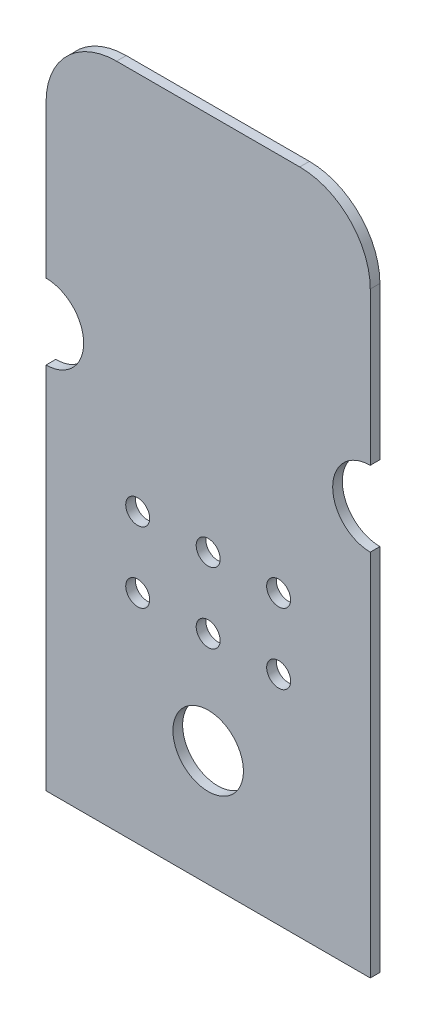
ISO-10303-21;
HEADER;
FILE_DESCRIPTION(('STEP AP214'),'2;1');
FILE_NAME('part.step','',(''),(''),'','','');
FILE_SCHEMA(('AUTOMOTIVE_DESIGN { 1 0 10303 214 1 1 1 1 }'));
ENDSEC;
DATA;
#1=APPLICATION_CONTEXT('core data for automotive mechanical design processes');
#2=APPLICATION_PROTOCOL_DEFINITION('international standard','automotive_design',2000,#1);
#3=PRODUCT_CONTEXT('',#1,'mechanical');
#4=PRODUCT('Part','Part','',(#3));
#5=PRODUCT_RELATED_PRODUCT_CATEGORY('part','',(#4));
#6=PRODUCT_DEFINITION_FORMATION('','',#4);
#7=PRODUCT_DEFINITION_CONTEXT('part definition',#1,'design');
#8=PRODUCT_DEFINITION('design','',#6,#7);
#9=PRODUCT_DEFINITION_SHAPE('','',#8);
#10=(LENGTH_UNIT() NAMED_UNIT(*) SI_UNIT(.MILLI.,.METRE.));
#11=(NAMED_UNIT(*) PLANE_ANGLE_UNIT() SI_UNIT($,.RADIAN.));
#12=(NAMED_UNIT(*) SI_UNIT($,.STERADIAN.) SOLID_ANGLE_UNIT());
#13=UNCERTAINTY_MEASURE_WITH_UNIT(LENGTH_MEASURE(1.E-05),#10,'distance_accuracy_value','');
#14=(GEOMETRIC_REPRESENTATION_CONTEXT(3) GLOBAL_UNCERTAINTY_ASSIGNED_CONTEXT((#13)) GLOBAL_UNIT_ASSIGNED_CONTEXT((#10,
#11,#12)) REPRESENTATION_CONTEXT('',''));
#15=CARTESIAN_POINT('',(0.,0.,0.));
#16=DIRECTION('',(0.,0.,1.));
#17=DIRECTION('',(1.,0.,0.));
#18=AXIS2_PLACEMENT_3D('',#15,#16,#17);
#19=CARTESIAN_POINT('',(32.3,39.114541286217,0.41148));
#20=DIRECTION('',(0.,0.,-1.));
#21=DIRECTION('',(-1.,0.,0.));
#22=AXIS2_PLACEMENT_3D('',#19,#20,#21);
#23=PLANE('',#22);
#24=CARTESIAN_POINT('',(29.3,37.645,0.41148));
#25=DIRECTION('',(0.,0.,-1.));
#26=DIRECTION('',(-1.,0.,0.));
#27=AXIS2_PLACEMENT_3D('',#24,#25,#26);
#28=CIRCLE('',#27,0.51);
#29=CARTESIAN_POINT('',(28.79,37.645,0.41148));
#30=VERTEX_POINT('',#29);
#31=EDGE_CURVE('E122',#30,#30,#28,.T.);
#32=ORIENTED_EDGE('',*,*,#31,.T.);
#33=EDGE_LOOP('',(#32));
#34=FACE_BOUND('',#33,.T.);
#35=CARTESIAN_POINT('',(32.3,37.645,0.41148));
#36=DIRECTION('',(0.,0.,-1.));
#37=DIRECTION('',(-1.,0.,0.));
#38=AXIS2_PLACEMENT_3D('',#35,#36,#37);
#39=CIRCLE('',#38,0.51);
#40=CARTESIAN_POINT('',(31.79,37.645,0.41148));
#41=VERTEX_POINT('',#40);
#42=EDGE_CURVE('E125',#41,#41,#39,.T.);
#43=ORIENTED_EDGE('',*,*,#42,.T.);
#44=EDGE_LOOP('',(#43));
#45=FACE_BOUND('',#44,.T.);
#46=CARTESIAN_POINT('',(29.3,34.645,0.41148));
#47=DIRECTION('',(0.,0.,-1.));
#48=DIRECTION('',(-1.,0.,0.));
#49=AXIS2_PLACEMENT_3D('',#46,#47,#48);
#50=CIRCLE('',#49,0.51);
#51=CARTESIAN_POINT('',(28.79,34.645,0.41148));
#52=VERTEX_POINT('',#51);
#53=EDGE_CURVE('E206',#52,#52,#50,.T.);
#54=ORIENTED_EDGE('',*,*,#53,.T.);
#55=EDGE_LOOP('',(#54));
#56=FACE_BOUND('',#55,.T.);
#57=CARTESIAN_POINT('',(32.3,34.645,0.41148));
#58=DIRECTION('',(0.,0.,-1.));
#59=DIRECTION('',(-1.,0.,0.));
#60=AXIS2_PLACEMENT_3D('',#57,#58,#59);
#61=CIRCLE('',#60,0.51);
#62=CARTESIAN_POINT('',(31.79,34.645,0.41148));
#63=VERTEX_POINT('',#62);
#64=EDGE_CURVE('E209',#63,#63,#61,.T.);
#65=ORIENTED_EDGE('',*,*,#64,.T.);
#66=EDGE_LOOP('',(#65));
#67=FACE_BOUND('',#66,.T.);
#68=CARTESIAN_POINT('',(35.3,37.645,0.41148));
#69=DIRECTION('',(0.,0.,-1.));
#70=DIRECTION('',(-1.,0.,0.));
#71=AXIS2_PLACEMENT_3D('',#68,#69,#70);
#72=CIRCLE('',#71,0.51);
#73=CARTESIAN_POINT('',(34.79,37.645,0.41148));
#74=VERTEX_POINT('',#73);
#75=EDGE_CURVE('E212',#74,#74,#72,.T.);
#76=ORIENTED_EDGE('',*,*,#75,.T.);
#77=EDGE_LOOP('',(#76));
#78=FACE_BOUND('',#77,.T.);
#79=CARTESIAN_POINT('',(35.3,34.645,0.41148));
#80=DIRECTION('',(0.,0.,-1.));
#81=DIRECTION('',(-1.,0.,0.));
#82=AXIS2_PLACEMENT_3D('',#79,#80,#81);
#83=CIRCLE('',#82,0.51);
#84=CARTESIAN_POINT('',(34.79,34.645,0.41148));
#85=VERTEX_POINT('',#84);
#86=EDGE_CURVE('E215',#85,#85,#83,.T.);
#87=ORIENTED_EDGE('',*,*,#86,.T.);
#88=EDGE_LOOP('',(#87));
#89=FACE_BOUND('',#88,.T.);
#90=CARTESIAN_POINT('',(32.3,30.325,0.41148));
#91=DIRECTION('',(0.,0.,-1.));
#92=DIRECTION('',(-1.,0.,0.));
#93=AXIS2_PLACEMENT_3D('',#90,#91,#92);
#94=CIRCLE('',#93,1.5);
#95=CARTESIAN_POINT('',(30.8,30.325,0.41148));
#96=VERTEX_POINT('',#95);
#97=EDGE_CURVE('E218',#96,#96,#94,.T.);
#98=ORIENTED_EDGE('',*,*,#97,.T.);
#99=EDGE_LOOP('',(#98));
#100=FACE_BOUND('',#99,.T.);
#101=CARTESIAN_POINT('',(39.2,42.7,0.41148));
#102=DIRECTION('',(0.,0.,-1.));
#103=DIRECTION('',(-1.,0.,0.));
#104=AXIS2_PLACEMENT_3D('',#101,#102,#103);
#105=CIRCLE('',#104,1.6);
#106=CARTESIAN_POINT('',(39.2,41.1,0.41148));
#107=VERTEX_POINT('',#106);
#108=CARTESIAN_POINT('',(39.2,44.3,0.41148));
#109=VERTEX_POINT('',#108);
#110=EDGE_CURVE('E135',#107,#109,#105,.T.);
#111=ORIENTED_EDGE('',*,*,#110,.T.);
#112=DIRECTION('',(0.,1.,0.));
#113=VECTOR('',#112,1.);
#114=CARTESIAN_POINT('',(39.2,50.8,0.41148));
#115=LINE('',#114,#113);
#116=CARTESIAN_POINT('',(39.1999999999996,50.8,0.41148));
#117=VERTEX_POINT('',#116);
#118=EDGE_CURVE('E139',#117,#109,#115,.F.);
#119=ORIENTED_EDGE('',*,*,#118,.F.);
#120=CARTESIAN_POINT('',(36.198905797101,50.798905797101,0.41148));
#121=DIRECTION('',(0.,0.,-1.));
#122=DIRECTION('',(-1.,0.,0.));
#123=AXIS2_PLACEMENT_3D('',#120,#121,#122);
#124=CIRCLE('',#123,3.001094402372);
#125=CARTESIAN_POINT('',(36.2,53.7999999999995,0.41148));
#126=VERTEX_POINT('',#125);
#127=EDGE_CURVE('E140',#126,#117,#124,.T.);
#128=ORIENTED_EDGE('',*,*,#127,.F.);
#129=DIRECTION('',(1.,0.,0.));
#130=VECTOR('',#129,1.);
#131=CARTESIAN_POINT('',(28.4,53.8,0.41148));
#132=LINE('',#131,#130);
#133=CARTESIAN_POINT('',(28.4,53.7999999999995,0.41148));
#134=VERTEX_POINT('',#133);
#135=EDGE_CURVE('E144',#134,#126,#132,.T.);
#136=ORIENTED_EDGE('',*,*,#135,.F.);
#137=CARTESIAN_POINT('',(28.401094202899,50.798905797101,0.41148));
#138=DIRECTION('',(0.,0.,-1.));
#139=DIRECTION('',(-1.,0.,0.));
#140=AXIS2_PLACEMENT_3D('',#137,#138,#139);
#141=CIRCLE('',#140,3.001094402372);
#142=CARTESIAN_POINT('',(25.4000000000004,50.8,0.41148));
#143=VERTEX_POINT('',#142);
#144=EDGE_CURVE('E148',#143,#134,#141,.T.);
#145=ORIENTED_EDGE('',*,*,#144,.F.);
#146=DIRECTION('',(0.,1.,0.));
#147=VECTOR('',#146,1.);
#148=CARTESIAN_POINT('',(25.4,44.3,0.41148));
#149=LINE('',#148,#147);
#150=CARTESIAN_POINT('',(25.4,44.3,0.41148));
#151=VERTEX_POINT('',#150);
#152=EDGE_CURVE('E152',#151,#143,#149,.T.);
#153=ORIENTED_EDGE('',*,*,#152,.F.);
#154=CARTESIAN_POINT('',(25.4,42.7,0.41148));
#155=DIRECTION('',(0.,0.,-1.));
#156=DIRECTION('',(-1.,0.,0.));
#157=AXIS2_PLACEMENT_3D('',#154,#155,#156);
#158=CIRCLE('',#157,1.6);
#159=CARTESIAN_POINT('',(25.4,41.1,0.41148));
#160=VERTEX_POINT('',#159);
#161=EDGE_CURVE('E20',#151,#160,#158,.T.);
#162=ORIENTED_EDGE('',*,*,#161,.T.);
#163=DIRECTION('',(0.,1.,0.));
#164=VECTOR('',#163,1.);
#165=CARTESIAN_POINT('',(25.4,25.4,0.41148));
#166=LINE('',#165,#164);
#167=CARTESIAN_POINT('',(25.4,25.4,0.41148));
#168=VERTEX_POINT('',#167);
#169=EDGE_CURVE('E108',#168,#160,#166,.T.);
#170=ORIENTED_EDGE('',*,*,#169,.F.);
#171=DIRECTION('',(1.,0.,0.));
#172=VECTOR('',#171,1.);
#173=CARTESIAN_POINT('',(39.2,25.4,0.41148));
#174=LINE('',#173,#172);
#175=CARTESIAN_POINT('',(39.2,25.4,0.41148));
#176=VERTEX_POINT('',#175);
#177=EDGE_CURVE('E94',#176,#168,#174,.F.);
#178=ORIENTED_EDGE('',*,*,#177,.F.);
#179=DIRECTION('',(0.,1.,0.));
#180=VECTOR('',#179,1.);
#181=CARTESIAN_POINT('',(39.2,41.1,0.41148));
#182=LINE('',#181,#180);
#183=EDGE_CURVE('E162',#107,#176,#182,.F.);
#184=ORIENTED_EDGE('',*,*,#183,.F.);
#185=EDGE_LOOP('',(#111,#119,#128,#136,#145,#153,#162,#170,#178,#184));
#186=FACE_BOUND('',#185,.T.);
#187=ADVANCED_FACE('F17',(#34,#45,#56,#67,#78,#89,#100,#186),#23,.F.);
#188=CARTESIAN_POINT('',(39.2,25.4,0.));
#189=DIRECTION('',(0.,-1.,0.));
#190=DIRECTION('',(0.,0.,-1.));
#191=AXIS2_PLACEMENT_3D('',#188,#189,#190);
#192=PLANE('',#191);
#193=DIRECTION('',(0.,0.,1.));
#194=VECTOR('',#193,1.);
#195=CARTESIAN_POINT('',(25.4,25.4,0.));
#196=LINE('',#195,#194);
#197=CARTESIAN_POINT('',(25.4,25.4,0.));
#198=VERTEX_POINT('',#197);
#199=EDGE_CURVE('E104',#198,#168,#196,.T.);
#200=ORIENTED_EDGE('',*,*,#199,.F.);
#201=DIRECTION('',(-1.,0.,0.));
#202=VECTOR('',#201,1.);
#203=CARTESIAN_POINT('',(32.3,25.4,0.));
#204=LINE('',#203,#202);
#205=CARTESIAN_POINT('',(39.2,25.4,0.));
#206=VERTEX_POINT('',#205);
#207=EDGE_CURVE('E101',#206,#198,#204,.T.);
#208=ORIENTED_EDGE('',*,*,#207,.F.);
#209=DIRECTION('',(0.,0.,-1.));
#210=VECTOR('',#209,1.);
#211=CARTESIAN_POINT('',(39.2,25.4,0.));
#212=LINE('',#211,#210);
#213=EDGE_CURVE('E165',#176,#206,#212,.T.);
#214=ORIENTED_EDGE('',*,*,#213,.F.);
#215=ORIENTED_EDGE('',*,*,#177,.T.);
#216=EDGE_LOOP('',(#200,#208,#214,#215));
#217=FACE_BOUND('',#216,.T.);
#218=ADVANCED_FACE('F106',(#217),#192,.T.);
#219=CARTESIAN_POINT('',(25.4,25.4,0.));
#220=DIRECTION('',(-1.,0.,0.));
#221=DIRECTION('',(0.,0.,1.));
#222=AXIS2_PLACEMENT_3D('',#219,#220,#221);
#223=PLANE('',#222);
#224=DIRECTION('',(0.,0.,-1.));
#225=VECTOR('',#224,1.);
#226=CARTESIAN_POINT('',(25.4,41.1,0.));
#227=LINE('',#226,#225);
#228=CARTESIAN_POINT('',(25.4,41.1,0.));
#229=VERTEX_POINT('',#228);
#230=EDGE_CURVE('E113',#160,#229,#227,.T.);
#231=ORIENTED_EDGE('',*,*,#230,.T.);
#232=DIRECTION('',(0.,1.,0.));
#233=VECTOR('',#232,1.);
#234=CARTESIAN_POINT('',(25.4,39.114541286217,0.));
#235=LINE('',#234,#233);
#236=EDGE_CURVE('E111',#198,#229,#235,.T.);
#237=ORIENTED_EDGE('',*,*,#236,.F.);
#238=ORIENTED_EDGE('',*,*,#199,.T.);
#239=ORIENTED_EDGE('',*,*,#169,.T.);
#240=EDGE_LOOP('',(#231,#237,#238,#239));
#241=FACE_BOUND('',#240,.T.);
#242=ADVANCED_FACE('F112',(#241),#223,.T.);
#243=CARTESIAN_POINT('',(25.4,42.7,0.));
#244=DIRECTION('',(0.,0.,-1.));
#245=DIRECTION('',(-1.,0.,0.));
#246=AXIS2_PLACEMENT_3D('',#243,#244,#245);
#247=CYLINDRICAL_SURFACE('',#246,1.6);
#248=ORIENTED_EDGE('',*,*,#161,.F.);
#249=DIRECTION('',(0.,0.,1.));
#250=VECTOR('',#249,1.);
#251=CARTESIAN_POINT('',(25.4,44.3,0.));
#252=LINE('',#251,#250);
#253=CARTESIAN_POINT('',(25.4,44.3,0.));
#254=VERTEX_POINT('',#253);
#255=EDGE_CURVE('E153',#254,#151,#252,.T.);
#256=ORIENTED_EDGE('',*,*,#255,.F.);
#257=CARTESIAN_POINT('',(25.4,42.7,0.));
#258=DIRECTION('',(0.,0.,-1.));
#259=DIRECTION('',(-1.,0.,0.));
#260=AXIS2_PLACEMENT_3D('',#257,#258,#259);
#261=CIRCLE('',#260,1.6);
#262=EDGE_CURVE('E116',#229,#254,#261,.F.);
#263=ORIENTED_EDGE('',*,*,#262,.F.);
#264=ORIENTED_EDGE('',*,*,#230,.F.);
#265=EDGE_LOOP('',(#248,#256,#263,#264));
#266=FACE_BOUND('',#265,.T.);
#267=ADVANCED_FACE('F397',(#266),#247,.F.);
#268=CARTESIAN_POINT('',(25.4,44.3,0.));
#269=DIRECTION('',(-1.,0.,0.));
#270=DIRECTION('',(0.,0.,1.));
#271=AXIS2_PLACEMENT_3D('',#268,#269,#270);
#272=PLANE('',#271);
#273=DIRECTION('',(0.,0.,-1.));
#274=VECTOR('',#273,1.);
#275=CARTESIAN_POINT('',(25.4000000000009,50.8,0.));
#276=LINE('',#275,#274);
#277=CARTESIAN_POINT('',(25.4000000000007,50.8,0.));
#278=VERTEX_POINT('',#277);
#279=EDGE_CURVE('E149',#278,#143,#276,.F.);
#280=ORIENTED_EDGE('',*,*,#279,.F.);
#281=DIRECTION('',(0.,1.,0.));
#282=VECTOR('',#281,1.);
#283=CARTESIAN_POINT('',(25.4,39.114541286217,0.));
#284=LINE('',#283,#282);
#285=EDGE_CURVE('E202',#254,#278,#284,.T.);
#286=ORIENTED_EDGE('',*,*,#285,.F.);
#287=ORIENTED_EDGE('',*,*,#255,.T.);
#288=ORIENTED_EDGE('',*,*,#152,.T.);
#289=EDGE_LOOP('',(#280,#286,#287,#288));
#290=FACE_BOUND('',#289,.T.);
#291=ADVANCED_FACE('F389',(#290),#272,.T.);
#292=CARTESIAN_POINT('',(28.401094202899,50.798905797101,0.));
#293=DIRECTION('',(0.,0.,-1.));
#294=DIRECTION('',(-1.,0.,0.));
#295=AXIS2_PLACEMENT_3D('',#292,#293,#294);
#296=CYLINDRICAL_SURFACE('',#295,3.001094402372);
#297=DIRECTION('',(0.,0.,1.));
#298=VECTOR('',#297,1.);
#299=CARTESIAN_POINT('',(28.4,53.8,0.));
#300=LINE('',#299,#298);
#301=CARTESIAN_POINT('',(28.4,53.8,0.));
#302=VERTEX_POINT('',#301);
#303=EDGE_CURVE('E145',#302,#134,#300,.T.);
#304=ORIENTED_EDGE('',*,*,#303,.F.);
#305=CARTESIAN_POINT('',(28.401094202899,50.798905797101,0.));
#306=DIRECTION('',(0.,0.,-1.));
#307=DIRECTION('',(-1.,0.,0.));
#308=AXIS2_PLACEMENT_3D('',#305,#306,#307);
#309=CIRCLE('',#308,3.001094402372);
#310=EDGE_CURVE('E199',#278,#302,#309,.T.);
#311=ORIENTED_EDGE('',*,*,#310,.F.);
#312=ORIENTED_EDGE('',*,*,#279,.T.);
#313=ORIENTED_EDGE('',*,*,#144,.T.);
#314=EDGE_LOOP('',(#304,#311,#312,#313));
#315=FACE_BOUND('',#314,.T.);
#316=ADVANCED_FACE('F225',(#315),#296,.T.);
#317=CARTESIAN_POINT('',(28.4,53.8,0.));
#318=DIRECTION('',(0.,1.,0.));
#319=DIRECTION('',(0.,0.,1.));
#320=AXIS2_PLACEMENT_3D('',#317,#318,#319);
#321=PLANE('',#320);
#322=DIRECTION('',(0.,0.,-1.));
#323=VECTOR('',#322,1.);
#324=CARTESIAN_POINT('',(36.2,53.7999999999991,0.));
#325=LINE('',#324,#323);
#326=CARTESIAN_POINT('',(36.2,53.7999999999993,0.));
#327=VERTEX_POINT('',#326);
#328=EDGE_CURVE('E141',#327,#126,#325,.F.);
#329=ORIENTED_EDGE('',*,*,#328,.F.);
#330=DIRECTION('',(-1.,0.,0.));
#331=VECTOR('',#330,1.);
#332=CARTESIAN_POINT('',(32.3,53.8,0.));
#333=LINE('',#332,#331);
#334=EDGE_CURVE('E198',#302,#327,#333,.F.);
#335=ORIENTED_EDGE('',*,*,#334,.F.);
#336=ORIENTED_EDGE('',*,*,#303,.T.);
#337=ORIENTED_EDGE('',*,*,#135,.T.);
#338=EDGE_LOOP('',(#329,#335,#336,#337));
#339=FACE_BOUND('',#338,.T.);
#340=ADVANCED_FACE('F231',(#339),#321,.T.);
#341=CARTESIAN_POINT('',(36.198905797101,50.798905797101,0.));
#342=DIRECTION('',(0.,0.,-1.));
#343=DIRECTION('',(-1.,0.,0.));
#344=AXIS2_PLACEMENT_3D('',#341,#342,#343);
#345=CYLINDRICAL_SURFACE('',#344,3.001094402372);
#346=DIRECTION('',(0.,0.,-1.));
#347=VECTOR('',#346,1.);
#348=CARTESIAN_POINT('',(39.2,50.8,0.));
#349=LINE('',#348,#347);
#350=CARTESIAN_POINT('',(39.2,50.8,0.));
#351=VERTEX_POINT('',#350);
#352=EDGE_CURVE('E136',#351,#117,#349,.F.);
#353=ORIENTED_EDGE('',*,*,#352,.F.);
#354=CARTESIAN_POINT('',(36.198905797101,50.798905797101,0.));
#355=DIRECTION('',(0.,0.,-1.));
#356=DIRECTION('',(-1.,0.,0.));
#357=AXIS2_PLACEMENT_3D('',#354,#355,#356);
#358=CIRCLE('',#357,3.001094402372);
#359=EDGE_CURVE('E195',#327,#351,#358,.T.);
#360=ORIENTED_EDGE('',*,*,#359,.F.);
#361=ORIENTED_EDGE('',*,*,#328,.T.);
#362=ORIENTED_EDGE('',*,*,#127,.T.);
#363=EDGE_LOOP('',(#353,#360,#361,#362));
#364=FACE_BOUND('',#363,.T.);
#365=ADVANCED_FACE('F255',(#364),#345,.T.);
#366=CARTESIAN_POINT('',(39.2,50.8,0.));
#367=DIRECTION('',(1.,0.,0.));
#368=DIRECTION('',(0.,0.,-1.));
#369=AXIS2_PLACEMENT_3D('',#366,#367,#368);
#370=PLANE('',#369);
#371=DIRECTION('',(0.,0.,-1.));
#372=VECTOR('',#371,1.);
#373=CARTESIAN_POINT('',(39.2,44.3,0.));
#374=LINE('',#373,#372);
#375=CARTESIAN_POINT('',(39.2,44.3,0.));
#376=VERTEX_POINT('',#375);
#377=EDGE_CURVE('E133',#109,#376,#374,.T.);
#378=ORIENTED_EDGE('',*,*,#377,.T.);
#379=DIRECTION('',(0.,1.,0.));
#380=VECTOR('',#379,1.);
#381=CARTESIAN_POINT('',(39.2,39.114541286217,0.));
#382=LINE('',#381,#380);
#383=EDGE_CURVE('E194',#351,#376,#382,.F.);
#384=ORIENTED_EDGE('',*,*,#383,.F.);
#385=ORIENTED_EDGE('',*,*,#352,.T.);
#386=ORIENTED_EDGE('',*,*,#118,.T.);
#387=EDGE_LOOP('',(#378,#384,#385,#386));
#388=FACE_BOUND('',#387,.T.);
#389=ADVANCED_FACE('F247',(#388),#370,.T.);
#390=CARTESIAN_POINT('',(39.2,42.7,0.));
#391=DIRECTION('',(0.,0.,-1.));
#392=DIRECTION('',(-1.,0.,0.));
#393=AXIS2_PLACEMENT_3D('',#390,#391,#392);
#394=CYLINDRICAL_SURFACE('',#393,1.6);
#395=ORIENTED_EDGE('',*,*,#110,.F.);
#396=DIRECTION('',(0.,0.,-1.));
#397=VECTOR('',#396,1.);
#398=CARTESIAN_POINT('',(39.2,41.1,0.));
#399=LINE('',#398,#397);
#400=CARTESIAN_POINT('',(39.2,41.1,0.));
#401=VERTEX_POINT('',#400);
#402=EDGE_CURVE('E35',#401,#107,#399,.F.);
#403=ORIENTED_EDGE('',*,*,#402,.F.);
#404=CARTESIAN_POINT('',(39.2,42.7,0.));
#405=DIRECTION('',(0.,0.,-1.));
#406=DIRECTION('',(-1.,0.,0.));
#407=AXIS2_PLACEMENT_3D('',#404,#405,#406);
#408=CIRCLE('',#407,1.6);
#409=EDGE_CURVE('E192',#376,#401,#408,.F.);
#410=ORIENTED_EDGE('',*,*,#409,.F.);
#411=ORIENTED_EDGE('',*,*,#377,.F.);
#412=EDGE_LOOP('',(#395,#403,#410,#411));
#413=FACE_BOUND('',#412,.T.);
#414=ADVANCED_FACE('F249',(#413),#394,.F.);
#415=CARTESIAN_POINT('',(39.2,41.1,0.));
#416=DIRECTION('',(1.,0.,0.));
#417=DIRECTION('',(0.,0.,-1.));
#418=AXIS2_PLACEMENT_3D('',#415,#416,#417);
#419=PLANE('',#418);
#420=ORIENTED_EDGE('',*,*,#213,.T.);
#421=DIRECTION('',(0.,1.,0.));
#422=VECTOR('',#421,1.);
#423=CARTESIAN_POINT('',(39.2,39.114541286217,0.));
#424=LINE('',#423,#422);
#425=EDGE_CURVE('E121',#401,#206,#424,.F.);
#426=ORIENTED_EDGE('',*,*,#425,.F.);
#427=ORIENTED_EDGE('',*,*,#402,.T.);
#428=ORIENTED_EDGE('',*,*,#183,.T.);
#429=EDGE_LOOP('',(#420,#426,#427,#428));
#430=FACE_BOUND('',#429,.T.);
#431=ADVANCED_FACE('F244',(#430),#419,.T.);
#432=CARTESIAN_POINT('',(32.3,30.325,0.));
#433=DIRECTION('',(0.,0.,-1.));
#434=DIRECTION('',(-1.,0.,0.));
#435=AXIS2_PLACEMENT_3D('',#432,#433,#434);
#436=CYLINDRICAL_SURFACE('',#435,1.5);
#437=ORIENTED_EDGE('',*,*,#97,.F.);
#438=EDGE_LOOP('',(#437));
#439=FACE_BOUND('',#438,.T.);
#440=CARTESIAN_POINT('',(32.3,30.325,0.));
#441=DIRECTION('',(0.,0.,-1.));
#442=DIRECTION('',(-1.,0.,0.));
#443=AXIS2_PLACEMENT_3D('',#440,#441,#442);
#444=CIRCLE('',#443,1.5);
#445=CARTESIAN_POINT('',(30.8,30.325,0.));
#446=VERTEX_POINT('',#445);
#447=EDGE_CURVE('E189',#446,#446,#444,.F.);
#448=ORIENTED_EDGE('',*,*,#447,.F.);
#449=EDGE_LOOP('',(#448));
#450=FACE_BOUND('',#449,.T.);
#451=ADVANCED_FACE('F295',(#439,#450),#436,.F.);
#452=CARTESIAN_POINT('',(35.3,34.645,0.));
#453=DIRECTION('',(0.,0.,-1.));
#454=DIRECTION('',(-1.,0.,0.));
#455=AXIS2_PLACEMENT_3D('',#452,#453,#454);
#456=CYLINDRICAL_SURFACE('',#455,0.51);
#457=ORIENTED_EDGE('',*,*,#86,.F.);
#458=EDGE_LOOP('',(#457));
#459=FACE_BOUND('',#458,.T.);
#460=CARTESIAN_POINT('',(35.3,34.645,0.));
#461=DIRECTION('',(0.,0.,-1.));
#462=DIRECTION('',(-1.,0.,0.));
#463=AXIS2_PLACEMENT_3D('',#460,#461,#462);
#464=CIRCLE('',#463,0.51);
#465=CARTESIAN_POINT('',(34.79,34.645,0.));
#466=VERTEX_POINT('',#465);
#467=EDGE_CURVE('E186',#466,#466,#464,.F.);
#468=ORIENTED_EDGE('',*,*,#467,.F.);
#469=EDGE_LOOP('',(#468));
#470=FACE_BOUND('',#469,.T.);
#471=ADVANCED_FACE('F291',(#459,#470),#456,.F.);
#472=CARTESIAN_POINT('',(35.3,37.645,0.));
#473=DIRECTION('',(0.,0.,-1.));
#474=DIRECTION('',(-1.,0.,0.));
#475=AXIS2_PLACEMENT_3D('',#472,#473,#474);
#476=CYLINDRICAL_SURFACE('',#475,0.51);
#477=ORIENTED_EDGE('',*,*,#75,.F.);
#478=EDGE_LOOP('',(#477));
#479=FACE_BOUND('',#478,.T.);
#480=CARTESIAN_POINT('',(35.3,37.645,0.));
#481=DIRECTION('',(0.,0.,-1.));
#482=DIRECTION('',(-1.,0.,0.));
#483=AXIS2_PLACEMENT_3D('',#480,#481,#482);
#484=CIRCLE('',#483,0.51);
#485=CARTESIAN_POINT('',(34.79,37.645,0.));
#486=VERTEX_POINT('',#485);
#487=EDGE_CURVE('E183',#486,#486,#484,.F.);
#488=ORIENTED_EDGE('',*,*,#487,.F.);
#489=EDGE_LOOP('',(#488));
#490=FACE_BOUND('',#489,.T.);
#491=ADVANCED_FACE('F287',(#479,#490),#476,.F.);
#492=CARTESIAN_POINT('',(32.3,34.645,0.));
#493=DIRECTION('',(0.,0.,-1.));
#494=DIRECTION('',(-1.,0.,0.));
#495=AXIS2_PLACEMENT_3D('',#492,#493,#494);
#496=CYLINDRICAL_SURFACE('',#495,0.51);
#497=ORIENTED_EDGE('',*,*,#64,.F.);
#498=EDGE_LOOP('',(#497));
#499=FACE_BOUND('',#498,.T.);
#500=CARTESIAN_POINT('',(32.3,34.645,0.));
#501=DIRECTION('',(0.,0.,-1.));
#502=DIRECTION('',(-1.,0.,0.));
#503=AXIS2_PLACEMENT_3D('',#500,#501,#502);
#504=CIRCLE('',#503,0.51);
#505=CARTESIAN_POINT('',(31.79,34.645,0.));
#506=VERTEX_POINT('',#505);
#507=EDGE_CURVE('E180',#506,#506,#504,.F.);
#508=ORIENTED_EDGE('',*,*,#507,.F.);
#509=EDGE_LOOP('',(#508));
#510=FACE_BOUND('',#509,.T.);
#511=ADVANCED_FACE('F283',(#499,#510),#496,.F.);
#512=CARTESIAN_POINT('',(29.3,34.645,0.));
#513=DIRECTION('',(0.,0.,-1.));
#514=DIRECTION('',(-1.,0.,0.));
#515=AXIS2_PLACEMENT_3D('',#512,#513,#514);
#516=CYLINDRICAL_SURFACE('',#515,0.51);
#517=ORIENTED_EDGE('',*,*,#53,.F.);
#518=EDGE_LOOP('',(#517));
#519=FACE_BOUND('',#518,.T.);
#520=CARTESIAN_POINT('',(29.3,34.645,0.));
#521=DIRECTION('',(0.,0.,-1.));
#522=DIRECTION('',(-1.,0.,0.));
#523=AXIS2_PLACEMENT_3D('',#520,#521,#522);
#524=CIRCLE('',#523,0.51);
#525=CARTESIAN_POINT('',(28.79,34.645,0.));
#526=VERTEX_POINT('',#525);
#527=EDGE_CURVE('E177',#526,#526,#524,.F.);
#528=ORIENTED_EDGE('',*,*,#527,.F.);
#529=EDGE_LOOP('',(#528));
#530=FACE_BOUND('',#529,.T.);
#531=ADVANCED_FACE('F279',(#519,#530),#516,.F.);
#532=CARTESIAN_POINT('',(32.3,37.645,0.));
#533=DIRECTION('',(0.,0.,-1.));
#534=DIRECTION('',(-1.,0.,0.));
#535=AXIS2_PLACEMENT_3D('',#532,#533,#534);
#536=CYLINDRICAL_SURFACE('',#535,0.51);
#537=ORIENTED_EDGE('',*,*,#42,.F.);
#538=EDGE_LOOP('',(#537));
#539=FACE_BOUND('',#538,.T.);
#540=CARTESIAN_POINT('',(32.3,37.645,0.));
#541=DIRECTION('',(0.,0.,-1.));
#542=DIRECTION('',(-1.,0.,0.));
#543=AXIS2_PLACEMENT_3D('',#540,#541,#542);
#544=CIRCLE('',#543,0.51);
#545=CARTESIAN_POINT('',(31.79,37.645,0.));
#546=VERTEX_POINT('',#545);
#547=EDGE_CURVE('E26',#546,#546,#544,.F.);
#548=ORIENTED_EDGE('',*,*,#547,.F.);
#549=EDGE_LOOP('',(#548));
#550=FACE_BOUND('',#549,.T.);
#551=ADVANCED_FACE('F272',(#539,#550),#536,.F.);
#552=CARTESIAN_POINT('',(29.3,37.645,0.));
#553=DIRECTION('',(0.,0.,-1.));
#554=DIRECTION('',(-1.,0.,0.));
#555=AXIS2_PLACEMENT_3D('',#552,#553,#554);
#556=CYLINDRICAL_SURFACE('',#555,0.51);
#557=ORIENTED_EDGE('',*,*,#31,.F.);
#558=EDGE_LOOP('',(#557));
#559=FACE_BOUND('',#558,.T.);
#560=CARTESIAN_POINT('',(29.3,37.645,0.));
#561=DIRECTION('',(0.,0.,-1.));
#562=DIRECTION('',(-1.,0.,0.));
#563=AXIS2_PLACEMENT_3D('',#560,#561,#562);
#564=CIRCLE('',#563,0.51);
#565=CARTESIAN_POINT('',(28.79,37.645,0.));
#566=VERTEX_POINT('',#565);
#567=EDGE_CURVE('E11',#566,#566,#564,.F.);
#568=ORIENTED_EDGE('',*,*,#567,.F.);
#569=EDGE_LOOP('',(#568));
#570=FACE_BOUND('',#569,.T.);
#571=ADVANCED_FACE('F266',(#559,#570),#556,.F.);
#572=CARTESIAN_POINT('',(32.3,39.114541286217,0.));
#573=DIRECTION('',(0.,0.,-1.));
#574=DIRECTION('',(-1.,0.,0.));
#575=AXIS2_PLACEMENT_3D('',#572,#573,#574);
#576=PLANE('',#575);
#577=ORIENTED_EDGE('',*,*,#567,.T.);
#578=EDGE_LOOP('',(#577));
#579=FACE_BOUND('',#578,.T.);
#580=ORIENTED_EDGE('',*,*,#547,.T.);
#581=EDGE_LOOP('',(#580));
#582=FACE_BOUND('',#581,.T.);
#583=ORIENTED_EDGE('',*,*,#527,.T.);
#584=EDGE_LOOP('',(#583));
#585=FACE_BOUND('',#584,.T.);
#586=ORIENTED_EDGE('',*,*,#507,.T.);
#587=EDGE_LOOP('',(#586));
#588=FACE_BOUND('',#587,.T.);
#589=ORIENTED_EDGE('',*,*,#487,.T.);
#590=EDGE_LOOP('',(#589));
#591=FACE_BOUND('',#590,.T.);
#592=ORIENTED_EDGE('',*,*,#467,.T.);
#593=EDGE_LOOP('',(#592));
#594=FACE_BOUND('',#593,.T.);
#595=ORIENTED_EDGE('',*,*,#447,.T.);
#596=EDGE_LOOP('',(#595));
#597=FACE_BOUND('',#596,.T.);
#598=ORIENTED_EDGE('',*,*,#409,.T.);
#599=ORIENTED_EDGE('',*,*,#425,.T.);
#600=ORIENTED_EDGE('',*,*,#207,.T.);
#601=ORIENTED_EDGE('',*,*,#236,.T.);
#602=ORIENTED_EDGE('',*,*,#262,.T.);
#603=ORIENTED_EDGE('',*,*,#285,.T.);
#604=ORIENTED_EDGE('',*,*,#310,.T.);
#605=ORIENTED_EDGE('',*,*,#334,.T.);
#606=ORIENTED_EDGE('',*,*,#359,.T.);
#607=ORIENTED_EDGE('',*,*,#383,.T.);
#608=EDGE_LOOP('',(#598,#599,#600,#601,#602,#603,#604,#605,#606,#607));
#609=FACE_BOUND('',#608,.T.);
#610=ADVANCED_FACE('F120',(#579,#582,#585,#588,#591,#594,#597,#609),#576,.T.);
#611=CLOSED_SHELL('',(#187,#218,#242,#267,#291,#316,#340,#365,#389,#414,#431,#451,#471,#491,
#511,#531,#551,#571,#610));
#612=MANIFOLD_SOLID_BREP('B1',#611);
#613=ADVANCED_BREP_SHAPE_REPRESENTATION('',(#18,#612),#14);
#614=SHAPE_DEFINITION_REPRESENTATION(#9,#613);
ENDSEC;
END-ISO-10303-21;
